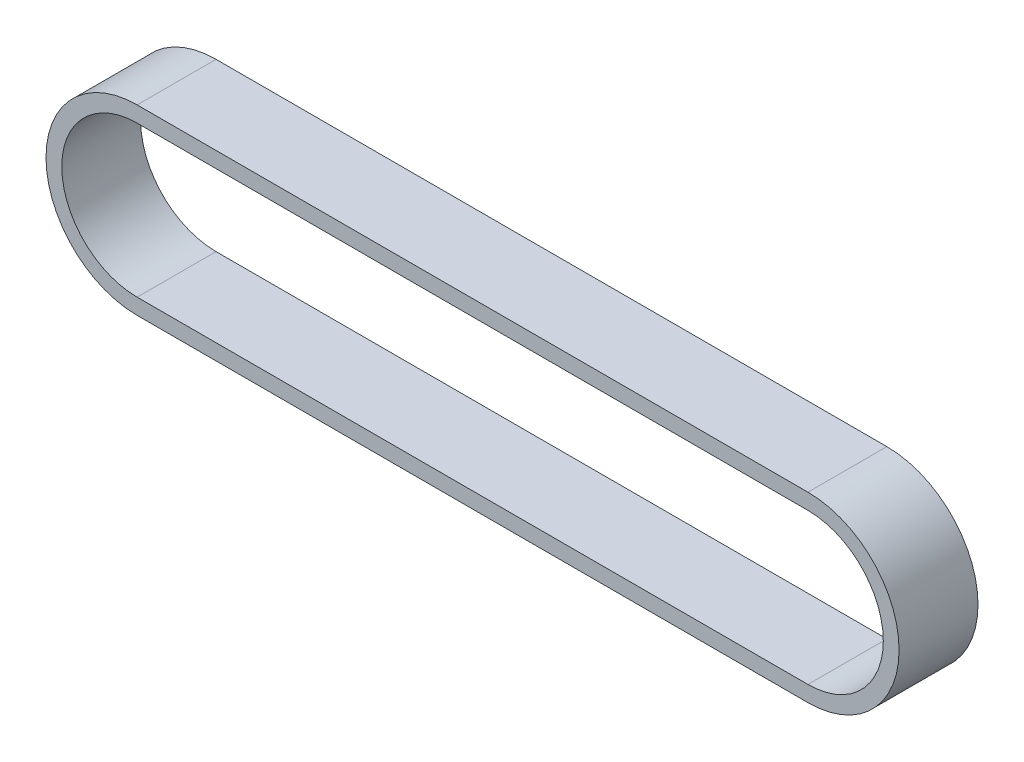
ISO-10303-21;
HEADER;
FILE_DESCRIPTION(('STEP AP214'),'2;1');
FILE_NAME('part.step','',(''),(''),'','','');
FILE_SCHEMA(('AUTOMOTIVE_DESIGN { 1 0 10303 214 1 1 1 1 }'));
ENDSEC;
DATA;
#1=APPLICATION_CONTEXT('core data for automotive mechanical design processes');
#2=APPLICATION_PROTOCOL_DEFINITION('international standard','automotive_design',2000,#1);
#3=PRODUCT_CONTEXT('',#1,'mechanical');
#4=PRODUCT('Part','Part','',(#3));
#5=PRODUCT_RELATED_PRODUCT_CATEGORY('part','',(#4));
#6=PRODUCT_DEFINITION_FORMATION('','',#4);
#7=PRODUCT_DEFINITION_CONTEXT('part definition',#1,'design');
#8=PRODUCT_DEFINITION('design','',#6,#7);
#9=PRODUCT_DEFINITION_SHAPE('','',#8);
#10=(LENGTH_UNIT() NAMED_UNIT(*) SI_UNIT(.MILLI.,.METRE.));
#11=(NAMED_UNIT(*) PLANE_ANGLE_UNIT() SI_UNIT($,.RADIAN.));
#12=(NAMED_UNIT(*) SI_UNIT($,.STERADIAN.) SOLID_ANGLE_UNIT());
#13=UNCERTAINTY_MEASURE_WITH_UNIT(LENGTH_MEASURE(1.E-05),#10,'distance_accuracy_value','');
#14=(GEOMETRIC_REPRESENTATION_CONTEXT(3) GLOBAL_UNCERTAINTY_ASSIGNED_CONTEXT((#13)) GLOBAL_UNIT_ASSIGNED_CONTEXT((#10,
#11,#12)) REPRESENTATION_CONTEXT('',''));
#15=CARTESIAN_POINT('',(0.,0.,0.));
#16=DIRECTION('',(0.,0.,1.));
#17=DIRECTION('',(1.,0.,0.));
#18=AXIS2_PLACEMENT_3D('',#15,#16,#17);
#19=CARTESIAN_POINT('',(0.,0.,-7.5));
#20=DIRECTION('',(0.,0.,1.));
#21=DIRECTION('',(1.,0.,0.));
#22=AXIS2_PLACEMENT_3D('',#19,#20,#21);
#23=CYLINDRICAL_SURFACE('',#22,17.325);
#24=CARTESIAN_POINT('',(0.,0.,7.5));
#25=DIRECTION('',(0.,0.,-1.));
#26=DIRECTION('',(-1.,0.,0.));
#27=AXIS2_PLACEMENT_3D('',#24,#25,#26);
#28=CIRCLE('',#27,17.325);
#29=CARTESIAN_POINT('',(-1.13958353356471E-12,17.325,7.5));
#30=VERTEX_POINT('',#29);
#31=CARTESIAN_POINT('',(1.13797860024079E-12,-17.325,7.5));
#32=VERTEX_POINT('',#31);
#33=EDGE_CURVE('E203',#30,#32,#28,.F.);
#34=ORIENTED_EDGE('',*,*,#33,.F.);
#35=DIRECTION('',(0.,0.,1.));
#36=VECTOR('',#35,1.);
#37=CARTESIAN_POINT('',(-1.13958353356471E-12,17.325,-7.5));
#38=LINE('',#37,#36);
#39=CARTESIAN_POINT('',(-1.13958353356471E-12,17.325,-7.5));
#40=VERTEX_POINT('',#39);
#41=EDGE_CURVE('E14',#40,#30,#38,.T.);
#42=ORIENTED_EDGE('',*,*,#41,.F.);
#43=CARTESIAN_POINT('',(0.,0.,-7.5));
#44=DIRECTION('',(0.,0.,-1.));
#45=DIRECTION('',(-1.,0.,0.));
#46=AXIS2_PLACEMENT_3D('',#43,#44,#45);
#47=CIRCLE('',#46,17.325);
#48=CARTESIAN_POINT('',(1.13797860024079E-12,-17.325,-7.5));
#49=VERTEX_POINT('',#48);
#50=EDGE_CURVE('E209',#40,#49,#47,.F.);
#51=ORIENTED_EDGE('',*,*,#50,.T.);
#52=DIRECTION('',(0.,0.,1.));
#53=VECTOR('',#52,1.);
#54=CARTESIAN_POINT('',(1.13797860024079E-12,-17.325,-7.5));
#55=LINE('',#54,#53);
#56=EDGE_CURVE('E80',#49,#32,#55,.T.);
#57=ORIENTED_EDGE('',*,*,#56,.T.);
#58=EDGE_LOOP('',(#34,#42,#51,#57));
#59=FACE_BOUND('',#58,.T.);
#60=ADVANCED_FACE('F77',(#59),#23,.T.);
#61=CARTESIAN_POINT('',(0.,17.325,-7.5));
#62=DIRECTION('',(0.,1.,0.));
#63=DIRECTION('',(0.,0.,1.));
#64=AXIS2_PLACEMENT_3D('',#61,#62,#63);
#65=PLANE('',#64);
#66=DIRECTION('',(-1.,0.,0.));
#67=VECTOR('',#66,1.);
#68=CARTESIAN_POINT('',(0.,17.325,7.5));
#69=LINE('',#68,#67);
#70=CARTESIAN_POINT('',(127.496685237325,17.325,7.5));
#71=VERTEX_POINT('',#70);
#72=EDGE_CURVE('E213',#71,#30,#69,.T.);
#73=ORIENTED_EDGE('',*,*,#72,.F.);
#74=DIRECTION('',(0.,0.,1.));
#75=VECTOR('',#74,1.);
#76=CARTESIAN_POINT('',(127.496685237325,17.325,-7.5));
#77=LINE('',#76,#75);
#78=CARTESIAN_POINT('',(127.496685237325,17.325,-7.5));
#79=VERTEX_POINT('',#78);
#80=EDGE_CURVE('E86',#79,#71,#77,.T.);
#81=ORIENTED_EDGE('',*,*,#80,.F.);
#82=DIRECTION('',(-1.,0.,0.));
#83=VECTOR('',#82,1.);
#84=CARTESIAN_POINT('',(0.,17.325,-7.5));
#85=LINE('',#84,#83);
#86=EDGE_CURVE('E221',#79,#40,#85,.T.);
#87=ORIENTED_EDGE('',*,*,#86,.T.);
#88=ORIENTED_EDGE('',*,*,#41,.T.);
#89=EDGE_LOOP('',(#73,#81,#87,#88));
#90=FACE_BOUND('',#89,.T.);
#91=ADVANCED_FACE('F257',(#90),#65,.T.);
#92=CARTESIAN_POINT('',(127.496685237326,0.,-7.5));
#93=DIRECTION('',(0.,0.,1.));
#94=DIRECTION('',(1.,0.,0.));
#95=AXIS2_PLACEMENT_3D('',#92,#93,#94);
#96=CYLINDRICAL_SURFACE('',#95,17.325);
#97=CARTESIAN_POINT('',(127.496685237326,0.,7.5));
#98=DIRECTION('',(0.,0.,-1.));
#99=DIRECTION('',(-1.,0.,0.));
#100=AXIS2_PLACEMENT_3D('',#97,#98,#99);
#101=CIRCLE('',#100,17.325);
#102=CARTESIAN_POINT('',(127.496685237327,-17.325,7.5));
#103=VERTEX_POINT('',#102);
#104=EDGE_CURVE('E232',#103,#71,#101,.F.);
#105=ORIENTED_EDGE('',*,*,#104,.F.);
#106=DIRECTION('',(0.,0.,1.));
#107=VECTOR('',#106,1.);
#108=CARTESIAN_POINT('',(127.496685237327,-17.325,-7.5));
#109=LINE('',#108,#107);
#110=CARTESIAN_POINT('',(127.496685237327,-17.325,-7.5));
#111=VERTEX_POINT('',#110);
#112=EDGE_CURVE('E240',#111,#103,#109,.T.);
#113=ORIENTED_EDGE('',*,*,#112,.F.);
#114=CARTESIAN_POINT('',(127.496685237326,0.,-7.5));
#115=DIRECTION('',(0.,0.,-1.));
#116=DIRECTION('',(-1.,0.,0.));
#117=AXIS2_PLACEMENT_3D('',#114,#115,#116);
#118=CIRCLE('',#117,17.325);
#119=EDGE_CURVE('E217',#111,#79,#118,.F.);
#120=ORIENTED_EDGE('',*,*,#119,.T.);
#121=ORIENTED_EDGE('',*,*,#80,.T.);
#122=EDGE_LOOP('',(#105,#113,#120,#121));
#123=FACE_BOUND('',#122,.T.);
#124=ADVANCED_FACE('F261',(#123),#96,.T.);
#125=CARTESIAN_POINT('',(0.,-17.325,-7.5));
#126=DIRECTION('',(0.,-1.,0.));
#127=DIRECTION('',(0.,0.,-1.));
#128=AXIS2_PLACEMENT_3D('',#125,#126,#127);
#129=PLANE('',#128);
#130=DIRECTION('',(1.,0.,0.));
#131=VECTOR('',#130,1.);
#132=CARTESIAN_POINT('',(0.,-17.325,7.5));
#133=LINE('',#132,#131);
#134=EDGE_CURVE('E228',#32,#103,#133,.T.);
#135=ORIENTED_EDGE('',*,*,#134,.F.);
#136=ORIENTED_EDGE('',*,*,#56,.F.);
#137=DIRECTION('',(1.,0.,0.));
#138=VECTOR('',#137,1.);
#139=CARTESIAN_POINT('',(0.,-17.325,-7.5));
#140=LINE('',#139,#138);
#141=EDGE_CURVE('E212',#49,#111,#140,.T.);
#142=ORIENTED_EDGE('',*,*,#141,.T.);
#143=ORIENTED_EDGE('',*,*,#112,.T.);
#144=EDGE_LOOP('',(#135,#136,#142,#143));
#145=FACE_BOUND('',#144,.T.);
#146=ADVANCED_FACE('F252',(#145),#129,.T.);
#147=CARTESIAN_POINT('',(0.,0.,-7.5));
#148=DIRECTION('',(0.,0.,-1.));
#149=DIRECTION('',(-1.,0.,0.));
#150=AXIS2_PLACEMENT_3D('',#147,#148,#149);
#151=PLANE('',#150);
#152=CARTESIAN_POINT('',(0.,0.,-7.5));
#153=DIRECTION('',(0.,0.,1.));
#154=DIRECTION('',(-1.,0.,0.));
#155=AXIS2_PLACEMENT_3D('',#152,#153,#154);
#156=CIRCLE('',#155,14.325);
#157=CARTESIAN_POINT('',(-1.13958353356471E-12,14.325,-7.5));
#158=VERTEX_POINT('',#157);
#159=CARTESIAN_POINT('',(1.13962271565087E-12,-14.325,-7.5));
#160=VERTEX_POINT('',#159);
#161=EDGE_CURVE('E161',#158,#160,#156,.T.);
#162=ORIENTED_EDGE('',*,*,#161,.T.);
#163=DIRECTION('',(1.,0.,0.));
#164=VECTOR('',#163,1.);
#165=CARTESIAN_POINT('',(127.496685237327,-14.325,-7.5));
#166=LINE('',#165,#164);
#167=CARTESIAN_POINT('',(127.496685237327,-14.325,-7.5));
#168=VERTEX_POINT('',#167);
#169=EDGE_CURVE('E171',#160,#168,#166,.T.);
#170=ORIENTED_EDGE('',*,*,#169,.T.);
#171=CARTESIAN_POINT('',(127.496685237326,0.,-7.5));
#172=DIRECTION('',(0.,0.,1.));
#173=DIRECTION('',(-1.,0.,0.));
#174=AXIS2_PLACEMENT_3D('',#171,#172,#173);
#175=CIRCLE('',#174,14.325);
#176=CARTESIAN_POINT('',(127.496685237325,14.325,-7.5));
#177=VERTEX_POINT('',#176);
#178=EDGE_CURVE('E97',#168,#177,#175,.T.);
#179=ORIENTED_EDGE('',*,*,#178,.T.);
#180=DIRECTION('',(-1.,0.,0.));
#181=VECTOR('',#180,1.);
#182=CARTESIAN_POINT('',(-1.13958353356471E-12,14.325,-7.5));
#183=LINE('',#182,#181);
#184=EDGE_CURVE('E168',#177,#158,#183,.T.);
#185=ORIENTED_EDGE('',*,*,#184,.T.);
#186=EDGE_LOOP('',(#162,#170,#179,#185));
#187=FACE_BOUND('',#186,.T.);
#188=ORIENTED_EDGE('',*,*,#50,.F.);
#189=ORIENTED_EDGE('',*,*,#86,.F.);
#190=ORIENTED_EDGE('',*,*,#119,.F.);
#191=ORIENTED_EDGE('',*,*,#141,.F.);
#192=EDGE_LOOP('',(#188,#189,#190,#191));
#193=FACE_BOUND('',#192,.T.);
#194=ADVANCED_FACE('F176',(#187,#193),#151,.T.);
#195=CARTESIAN_POINT('',(0.,0.,7.5));
#196=DIRECTION('',(0.,0.,-1.));
#197=DIRECTION('',(-1.,0.,0.));
#198=AXIS2_PLACEMENT_3D('',#195,#196,#197);
#199=PLANE('',#198);
#200=DIRECTION('',(1.,0.,0.));
#201=VECTOR('',#200,1.);
#202=CARTESIAN_POINT('',(127.496685237327,-14.325,7.5));
#203=LINE('',#202,#201);
#204=CARTESIAN_POINT('',(1.13962271444992E-12,-14.325,7.5));
#205=VERTEX_POINT('',#204);
#206=CARTESIAN_POINT('',(127.496685237327,-14.325,7.5));
#207=VERTEX_POINT('',#206);
#208=EDGE_CURVE('E194',#205,#207,#203,.T.);
#209=ORIENTED_EDGE('',*,*,#208,.F.);
#210=CARTESIAN_POINT('',(0.,0.,7.5));
#211=DIRECTION('',(0.,0.,1.));
#212=DIRECTION('',(-1.,0.,0.));
#213=AXIS2_PLACEMENT_3D('',#210,#211,#212);
#214=CIRCLE('',#213,14.325);
#215=CARTESIAN_POINT('',(-1.13958353356471E-12,14.325,7.5));
#216=VERTEX_POINT('',#215);
#217=EDGE_CURVE('E108',#216,#205,#214,.T.);
#218=ORIENTED_EDGE('',*,*,#217,.F.);
#219=DIRECTION('',(-1.,0.,0.));
#220=VECTOR('',#219,1.);
#221=CARTESIAN_POINT('',(-1.13958353356471E-12,14.325,7.5));
#222=LINE('',#221,#220);
#223=CARTESIAN_POINT('',(127.496685237325,14.325,7.5));
#224=VERTEX_POINT('',#223);
#225=EDGE_CURVE('E180',#224,#216,#222,.T.);
#226=ORIENTED_EDGE('',*,*,#225,.F.);
#227=CARTESIAN_POINT('',(127.496685237326,0.,7.5));
#228=DIRECTION('',(0.,0.,1.));
#229=DIRECTION('',(-1.,0.,0.));
#230=AXIS2_PLACEMENT_3D('',#227,#228,#229);
#231=CIRCLE('',#230,14.325);
#232=EDGE_CURVE('E185',#207,#224,#231,.T.);
#233=ORIENTED_EDGE('',*,*,#232,.F.);
#234=EDGE_LOOP('',(#209,#218,#226,#233));
#235=FACE_BOUND('',#234,.T.);
#236=ORIENTED_EDGE('',*,*,#33,.T.);
#237=ORIENTED_EDGE('',*,*,#134,.T.);
#238=ORIENTED_EDGE('',*,*,#104,.T.);
#239=ORIENTED_EDGE('',*,*,#72,.T.);
#240=EDGE_LOOP('',(#236,#237,#238,#239));
#241=FACE_BOUND('',#240,.T.);
#242=ADVANCED_FACE('F254',(#235,#241),#199,.F.);
#243=CARTESIAN_POINT('',(0.,0.,-7.5));
#244=DIRECTION('',(0.,0.,1.));
#245=DIRECTION('',(1.,0.,0.));
#246=AXIS2_PLACEMENT_3D('',#243,#244,#245);
#247=CYLINDRICAL_SURFACE('',#246,14.325);
#248=ORIENTED_EDGE('',*,*,#217,.T.);
#249=DIRECTION('',(0.,0.,1.));
#250=VECTOR('',#249,1.);
#251=CARTESIAN_POINT('',(1.13962271565087E-12,-14.325,-7.5));
#252=LINE('',#251,#250);
#253=EDGE_CURVE('E157',#160,#205,#252,.T.);
#254=ORIENTED_EDGE('',*,*,#253,.F.);
#255=ORIENTED_EDGE('',*,*,#161,.F.);
#256=DIRECTION('',(0.,0.,1.));
#257=VECTOR('',#256,1.);
#258=CARTESIAN_POINT('',(-1.13958353356471E-12,14.325,-7.5));
#259=LINE('',#258,#257);
#260=EDGE_CURVE('E200',#158,#216,#259,.T.);
#261=ORIENTED_EDGE('',*,*,#260,.T.);
#262=EDGE_LOOP('',(#248,#254,#255,#261));
#263=FACE_BOUND('',#262,.T.);
#264=ADVANCED_FACE('F159',(#263),#247,.F.);
#265=CARTESIAN_POINT('',(-1.13958353356471E-12,14.325,-7.5));
#266=DIRECTION('',(0.,1.,0.));
#267=DIRECTION('',(0.,0.,1.));
#268=AXIS2_PLACEMENT_3D('',#265,#266,#267);
#269=PLANE('',#268);
#270=ORIENTED_EDGE('',*,*,#225,.T.);
#271=ORIENTED_EDGE('',*,*,#260,.F.);
#272=ORIENTED_EDGE('',*,*,#184,.F.);
#273=DIRECTION('',(0.,0.,1.));
#274=VECTOR('',#273,1.);
#275=CARTESIAN_POINT('',(127.496685237325,14.325,-7.5));
#276=LINE('',#275,#274);
#277=EDGE_CURVE('E204',#177,#224,#276,.T.);
#278=ORIENTED_EDGE('',*,*,#277,.T.);
#279=EDGE_LOOP('',(#270,#271,#272,#278));
#280=FACE_BOUND('',#279,.T.);
#281=ADVANCED_FACE('F328',(#280),#269,.F.);
#282=CARTESIAN_POINT('',(127.496685237326,0.,-7.5));
#283=DIRECTION('',(0.,0.,1.));
#284=DIRECTION('',(1.,0.,0.));
#285=AXIS2_PLACEMENT_3D('',#282,#283,#284);
#286=CYLINDRICAL_SURFACE('',#285,14.325);
#287=ORIENTED_EDGE('',*,*,#232,.T.);
#288=ORIENTED_EDGE('',*,*,#277,.F.);
#289=ORIENTED_EDGE('',*,*,#178,.F.);
#290=DIRECTION('',(0.,0.,1.));
#291=VECTOR('',#290,1.);
#292=CARTESIAN_POINT('',(127.496685237327,-14.325,-7.5));
#293=LINE('',#292,#291);
#294=EDGE_CURVE('E167',#168,#207,#293,.T.);
#295=ORIENTED_EDGE('',*,*,#294,.T.);
#296=EDGE_LOOP('',(#287,#288,#289,#295));
#297=FACE_BOUND('',#296,.T.);
#298=ADVANCED_FACE('F336',(#297),#286,.F.);
#299=CARTESIAN_POINT('',(127.496685237327,-14.325,-7.5));
#300=DIRECTION('',(0.,-1.,0.));
#301=DIRECTION('',(0.,0.,-1.));
#302=AXIS2_PLACEMENT_3D('',#299,#300,#301);
#303=PLANE('',#302);
#304=ORIENTED_EDGE('',*,*,#208,.T.);
#305=ORIENTED_EDGE('',*,*,#294,.F.);
#306=ORIENTED_EDGE('',*,*,#169,.F.);
#307=ORIENTED_EDGE('',*,*,#253,.T.);
#308=EDGE_LOOP('',(#304,#305,#306,#307));
#309=FACE_BOUND('',#308,.T.);
#310=ADVANCED_FACE('F172',(#309),#303,.F.);
#311=CLOSED_SHELL('',(#60,#91,#124,#146,#194,#242,#264,#281,#298,#310));
#312=MANIFOLD_SOLID_BREP('B2',#311);
#313=ADVANCED_BREP_SHAPE_REPRESENTATION('',(#18,#312),#14);
#314=SHAPE_DEFINITION_REPRESENTATION(#9,#313);
ENDSEC;
END-ISO-10303-21;
